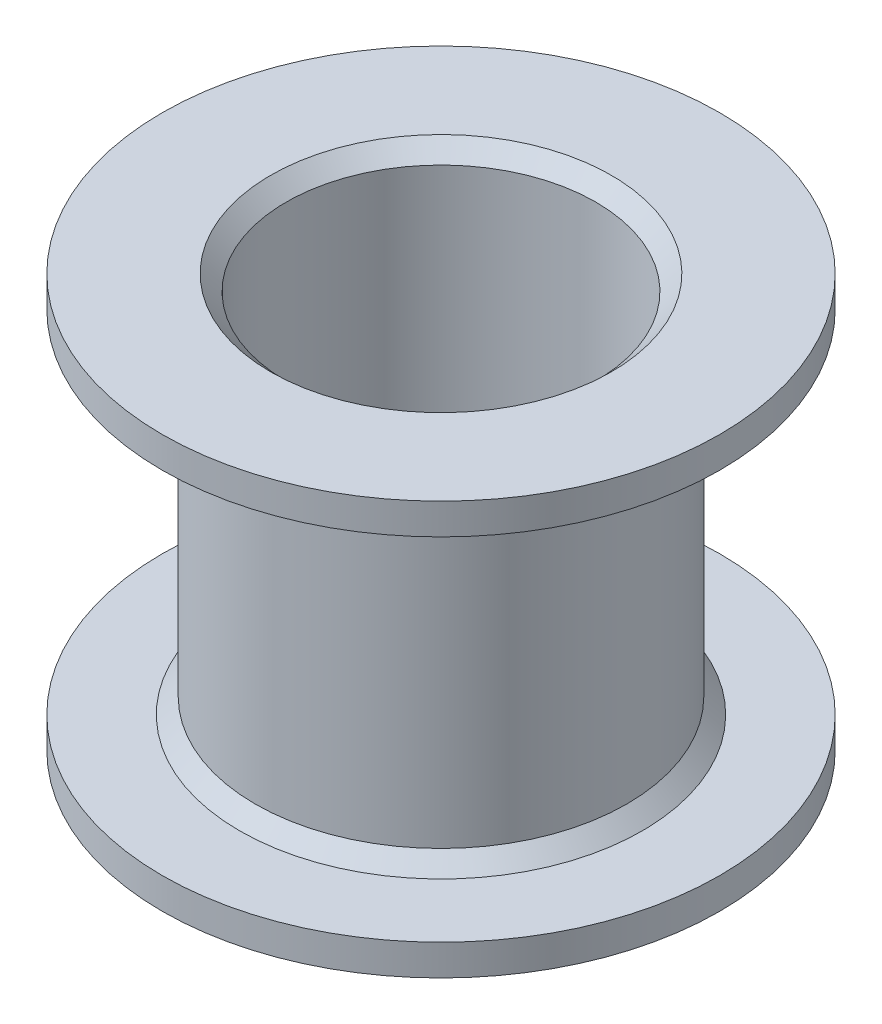
ISO-10303-21;
HEADER;
FILE_DESCRIPTION(('STEP AP214'),'2;1');
FILE_NAME('part.step','',(''),(''),'','','');
FILE_SCHEMA(('AUTOMOTIVE_DESIGN { 1 0 10303 214 1 1 1 1 }'));
ENDSEC;
DATA;
#1=APPLICATION_CONTEXT('core data for automotive mechanical design processes');
#2=APPLICATION_PROTOCOL_DEFINITION('international standard','automotive_design',2000,#1);
#3=PRODUCT_CONTEXT('',#1,'mechanical');
#4=PRODUCT('Part','Part','',(#3));
#5=PRODUCT_RELATED_PRODUCT_CATEGORY('part','',(#4));
#6=PRODUCT_DEFINITION_FORMATION('','',#4);
#7=PRODUCT_DEFINITION_CONTEXT('part definition',#1,'design');
#8=PRODUCT_DEFINITION('design','',#6,#7);
#9=PRODUCT_DEFINITION_SHAPE('','',#8);
#10=(LENGTH_UNIT() NAMED_UNIT(*) SI_UNIT(.MILLI.,.METRE.));
#11=(NAMED_UNIT(*) PLANE_ANGLE_UNIT() SI_UNIT($,.RADIAN.));
#12=(NAMED_UNIT(*) SI_UNIT($,.STERADIAN.) SOLID_ANGLE_UNIT());
#13=UNCERTAINTY_MEASURE_WITH_UNIT(LENGTH_MEASURE(1.E-05),#10,'distance_accuracy_value','');
#14=(GEOMETRIC_REPRESENTATION_CONTEXT(3) GLOBAL_UNCERTAINTY_ASSIGNED_CONTEXT((#13)) GLOBAL_UNIT_ASSIGNED_CONTEXT((#10,
#11,#12)) REPRESENTATION_CONTEXT('',''));
#15=CARTESIAN_POINT('',(0.,0.,0.));
#16=DIRECTION('',(0.,0.,1.));
#17=DIRECTION('',(1.,0.,0.));
#18=AXIS2_PLACEMENT_3D('',#15,#16,#17);
#19=CARTESIAN_POINT('',(0.,1.69999999999998,0.));
#20=DIRECTION('',(0.,-0.999999999999999,0.));
#21=DIRECTION('',(0.,0.,-0.999999999999999));
#22=AXIS2_PLACEMENT_3D('',#19,#20,#21);
#23=CYLINDRICAL_SURFACE('',#22,1.8);
#24=CARTESIAN_POINT('',(0.,1.55,0.));
#25=DIRECTION('',(0.,0.999999999999999,0.));
#26=DIRECTION('',(0.,0.,0.999999999999999));
#27=AXIS2_PLACEMENT_3D('',#24,#25,#26);
#28=CIRCLE('',#27,1.8);
#29=CARTESIAN_POINT('',(0.,1.55,-1.8));
#30=VERTEX_POINT('',#29);
#31=EDGE_CURVE('E43',#30,#30,#28,.F.);
#32=CARTESIAN_POINT('',(0.,-1.55000000000002,0.));
#33=DIRECTION('',(0.,0.999999999999999,0.));
#34=DIRECTION('',(0.,0.,0.999999999999999));
#35=AXIS2_PLACEMENT_3D('',#32,#33,#34);
#36=CIRCLE('',#35,1.8);
#37=CARTESIAN_POINT('',(0.,-1.55000000000002,-1.8));
#38=VERTEX_POINT('',#37);
#39=EDGE_CURVE('E64',#38,#38,#36,.F.);
#40=CARTESIAN_POINT('',(0.,1.55,-1.8));
#41=CARTESIAN_POINT('',(0.,1.51770833333333,-1.8));
#42=CARTESIAN_POINT('',(0.,1.48541666666667,-1.8));
#43=CARTESIAN_POINT('',(0.,1.42083333333333,-1.8));
#44=CARTESIAN_POINT('',(0.,1.38854166666667,-1.8));
#45=CARTESIAN_POINT('',(0.,1.32395833333333,-1.8));
#46=CARTESIAN_POINT('',(0.,1.29166666666666,-1.8));
#47=CARTESIAN_POINT('',(0.,1.22708333333333,-1.8));
#48=CARTESIAN_POINT('',(0.,1.19479166666666,-1.8));
#49=CARTESIAN_POINT('',(0.,1.13020833333333,-1.8));
#50=CARTESIAN_POINT('',(0.,1.09791666666666,-1.8));
#51=CARTESIAN_POINT('',(0.,1.03333333333333,-1.8));
#52=CARTESIAN_POINT('',(0.,1.00104166666666,-1.8));
#53=CARTESIAN_POINT('',(0.,0.93645833333333,-1.8));
#54=CARTESIAN_POINT('',(0.,0.904166666666663,-1.8));
#55=CARTESIAN_POINT('',(0.,0.839583333333329,-1.8));
#56=CARTESIAN_POINT('',(0.,0.807291666666662,-1.8));
#57=CARTESIAN_POINT('',(0.,0.742708333333329,-1.8));
#58=CARTESIAN_POINT('',(0.,0.710416666666662,-1.8));
#59=CARTESIAN_POINT('',(0.,0.645833333333328,-1.8));
#60=CARTESIAN_POINT('',(0.,0.613541666666661,-1.8));
#61=CARTESIAN_POINT('',(0.,0.548958333333328,-1.8));
#62=CARTESIAN_POINT('',(0.,0.516666666666661,-1.8));
#63=CARTESIAN_POINT('',(0.,0.452083333333327,-1.8));
#64=CARTESIAN_POINT('',(0.,0.41979166666666,-1.8));
#65=CARTESIAN_POINT('',(0.,0.355208333333327,-1.8));
#66=CARTESIAN_POINT('',(0.,0.32291666666666,-1.8));
#67=CARTESIAN_POINT('',(0.,0.258333333333326,-1.8));
#68=CARTESIAN_POINT('',(0.,0.226041666666659,-1.8));
#69=CARTESIAN_POINT('',(0.,0.161458333333326,-1.8));
#70=CARTESIAN_POINT('',(0.,0.129166666666659,-1.8));
#71=CARTESIAN_POINT('',(0.,0.0645833333333251,-1.8));
#72=CARTESIAN_POINT('',(0.,0.0322916666666582,-1.8));
#73=CARTESIAN_POINT('',(0.,-0.0322916666666755,-1.8));
#74=CARTESIAN_POINT('',(0.,-0.0645833333333423,-1.8));
#75=CARTESIAN_POINT('',(0.,-0.129166666666676,-1.8));
#76=CARTESIAN_POINT('',(0.,-0.161458333333343,-1.8));
#77=CARTESIAN_POINT('',(0.,-0.226041666666676,-1.8));
#78=CARTESIAN_POINT('',(0.,-0.258333333333343,-1.8));
#79=CARTESIAN_POINT('',(0.,-0.322916666666676,-1.8));
#80=CARTESIAN_POINT('',(0.,-0.355208333333343,-1.8));
#81=CARTESIAN_POINT('',(0.,-0.419791666666677,-1.8));
#82=CARTESIAN_POINT('',(0.,-0.452083333333344,-1.8));
#83=CARTESIAN_POINT('',(0.,-0.516666666666678,-1.8));
#84=CARTESIAN_POINT('',(0.,-0.548958333333345,-1.8));
#85=CARTESIAN_POINT('',(0.,-0.613541666666678,-1.8));
#86=CARTESIAN_POINT('',(0.,-0.645833333333345,-1.8));
#87=CARTESIAN_POINT('',(0.,-0.710416666666679,-1.8));
#88=CARTESIAN_POINT('',(0.,-0.742708333333346,-1.8));
#89=CARTESIAN_POINT('',(0.,-0.80729166666668,-1.8));
#90=CARTESIAN_POINT('',(0.,-0.839583333333346,-1.8));
#91=CARTESIAN_POINT('',(0.,-0.90416666666668,-1.8));
#92=CARTESIAN_POINT('',(0.,-0.936458333333347,-1.8));
#93=CARTESIAN_POINT('',(0.,-1.00104166666668,-1.8));
#94=CARTESIAN_POINT('',(0.,-1.03333333333335,-1.8));
#95=CARTESIAN_POINT('',(0.,-1.09791666666668,-1.8));
#96=CARTESIAN_POINT('',(0.,-1.13020833333335,-1.8));
#97=CARTESIAN_POINT('',(0.,-1.19479166666668,-1.8));
#98=CARTESIAN_POINT('',(0.,-1.22708333333335,-1.8));
#99=CARTESIAN_POINT('',(0.,-1.29166666666668,-1.8));
#100=CARTESIAN_POINT('',(0.,-1.32395833333335,-1.8));
#101=CARTESIAN_POINT('',(0.,-1.38854166666668,-1.8));
#102=CARTESIAN_POINT('',(0.,-1.42083333333335,-1.8));
#103=CARTESIAN_POINT('',(0.,-1.48541666666668,-1.8));
#104=CARTESIAN_POINT('',(0.,-1.51770833333335,-1.8));
#105=CARTESIAN_POINT('',(0.,-1.55000000000002,-1.8));
#106=B_SPLINE_CURVE_WITH_KNOTS('',3,(#40,#41,#42,#43,#44,#45,#46,#47,#48,#49,#50,#51,#52,#53,
#54,#55,#56,#57,#58,#59,#60,#61,#62,#63,#64,#65,#66,#67,#68,#69,#70,#71,#72,#73,#74,#75,#76,#77,
#78,#79,#80,#81,#82,#83,#84,#85,#86,#87,#88,#89,#90,#91,#92,#93,#94,#95,#96,#97,#98,#99,#100,
#101,#102,#103,#104,#105),.UNSPECIFIED.,.F.,.F.,(4,2,2,2,2,2,2,2,2,2,2,2,2,2,2,2,2,2,2,2,2,2,2,
2,2,2,2,2,2,2,2,2,4),(0.,0.0968750000000006,0.193750000000001,0.290625000000002,
0.387500000000002,0.484375000000003,0.581250000000003,0.678125000000004,0.775000000000004,
0.871875000000005,0.968750000000005,1.06562500000001,1.16250000000001,1.25937500000001,
1.35625000000001,1.45312500000001,1.55000000000001,1.64687500000001,1.74375000000001,
1.84062500000001,1.93750000000001,2.03437500000001,2.13125000000001,2.22812500000001,
2.32500000000001,2.42187500000001,2.51875000000001,2.61562500000001,2.71250000000001,
2.80937500000001,2.90625000000001,3.00312500000002,3.10000000000002),.UNSPECIFIED.);
#107=EDGE_CURVE('BSEAM32',#30,#38,#106,.T.);
#108=ORIENTED_EDGE('',*,*,#31,.T.);
#109=ORIENTED_EDGE('',*,*,#39,.F.);
#110=ORIENTED_EDGE('',*,*,#107,.T.);
#111=ORIENTED_EDGE('',*,*,#107,.F.);
#112=EDGE_LOOP('',(#108,#110,#109,#111));
#113=FACE_BOUND('',#112,.T.);
#114=ADVANCED_FACE('F32',(#113),#23,.T.);
#115=CARTESIAN_POINT('',(0.,1.69999999999998,0.));
#116=DIRECTION('',(0.,-0.999999999999999,0.));
#117=DIRECTION('',(0.,0.,-0.999999999999999));
#118=AXIS2_PLACEMENT_3D('',#115,#116,#117);
#119=CYLINDRICAL_SURFACE('',#118,1.5);
#120=CARTESIAN_POINT('',(0.,1.84999999999999,0.));
#121=DIRECTION('',(0.,0.999999999999999,0.));
#122=DIRECTION('',(0.,0.,0.999999999999999));
#123=AXIS2_PLACEMENT_3D('',#120,#121,#122);
#124=CIRCLE('',#123,1.5);
#125=CARTESIAN_POINT('',(0.,1.84999999999999,-1.5));
#126=VERTEX_POINT('',#125);
#127=EDGE_CURVE('E39',#126,#126,#124,.T.);
#128=CARTESIAN_POINT('',(0.,-1.85000000000001,0.));
#129=DIRECTION('',(0.,0.999999999999999,0.));
#130=DIRECTION('',(0.,0.,0.999999999999999));
#131=AXIS2_PLACEMENT_3D('',#128,#129,#130);
#132=CIRCLE('',#131,1.5);
#133=CARTESIAN_POINT('',(0.,-1.85000000000001,-1.5));
#134=VERTEX_POINT('',#133);
#135=EDGE_CURVE('E61',#134,#134,#132,.T.);
#136=CARTESIAN_POINT('',(0.,1.84999999999999,-1.5));
#137=CARTESIAN_POINT('',(0.,1.81145833333333,-1.5));
#138=CARTESIAN_POINT('',(0.,1.77291666666666,-1.5));
#139=CARTESIAN_POINT('',(0.,1.69583333333333,-1.5));
#140=CARTESIAN_POINT('',(0.,1.65729166666666,-1.5));
#141=CARTESIAN_POINT('',(0.,1.58020833333333,-1.5));
#142=CARTESIAN_POINT('',(0.,1.54166666666666,-1.5));
#143=CARTESIAN_POINT('',(0.,1.46458333333333,-1.5));
#144=CARTESIAN_POINT('',(0.,1.42604166666666,-1.5));
#145=CARTESIAN_POINT('',(0.,1.34895833333333,-1.5));
#146=CARTESIAN_POINT('',(0.,1.31041666666666,-1.5));
#147=CARTESIAN_POINT('',(0.,1.23333333333333,-1.5));
#148=CARTESIAN_POINT('',(0.,1.19479166666666,-1.5));
#149=CARTESIAN_POINT('',(0.,1.11770833333333,-1.5));
#150=CARTESIAN_POINT('',(0.,1.07916666666666,-1.5));
#151=CARTESIAN_POINT('',(0.,1.00208333333333,-1.5));
#152=CARTESIAN_POINT('',(0.,0.96354166666666,-1.5));
#153=CARTESIAN_POINT('',(0.,0.886458333333327,-1.5));
#154=CARTESIAN_POINT('',(0.,0.84791666666666,-1.5));
#155=CARTESIAN_POINT('',(0.,0.770833333333327,-1.5));
#156=CARTESIAN_POINT('',(0.,0.73229166666666,-1.5));
#157=CARTESIAN_POINT('',(0.,0.655208333333327,-1.5));
#158=CARTESIAN_POINT('',(0.,0.61666666666666,-1.5));
#159=CARTESIAN_POINT('',(0.,0.539583333333327,-1.5));
#160=CARTESIAN_POINT('',(0.,0.50104166666666,-1.5));
#161=CARTESIAN_POINT('',(0.,0.423958333333327,-1.5));
#162=CARTESIAN_POINT('',(0.,0.38541666666666,-1.5));
#163=CARTESIAN_POINT('',(0.,0.308333333333327,-1.5));
#164=CARTESIAN_POINT('',(0.,0.26979166666666,-1.5));
#165=CARTESIAN_POINT('',(0.,0.192708333333327,-1.5));
#166=CARTESIAN_POINT('',(0.,0.15416666666666,-1.5));
#167=CARTESIAN_POINT('',(0.,0.0770833333333267,-1.5));
#168=CARTESIAN_POINT('',(0.,0.03854166666666,-1.5));
#169=CARTESIAN_POINT('',(0.,-0.0385416666666734,-1.5));
#170=CARTESIAN_POINT('',(0.,-0.0770833333333401,-1.5));
#171=CARTESIAN_POINT('',(0.,-0.154166666666673,-1.5));
#172=CARTESIAN_POINT('',(0.,-0.19270833333334,-1.5));
#173=CARTESIAN_POINT('',(0.,-0.269791666666673,-1.5));
#174=CARTESIAN_POINT('',(0.,-0.30833333333334,-1.5));
#175=CARTESIAN_POINT('',(0.,-0.385416666666673,-1.5));
#176=CARTESIAN_POINT('',(0.,-0.42395833333334,-1.5));
#177=CARTESIAN_POINT('',(0.,-0.501041666666673,-1.5));
#178=CARTESIAN_POINT('',(0.,-0.53958333333334,-1.5));
#179=CARTESIAN_POINT('',(0.,-0.616666666666674,-1.5));
#180=CARTESIAN_POINT('',(0.,-0.65520833333334,-1.5));
#181=CARTESIAN_POINT('',(0.,-0.732291666666674,-1.5));
#182=CARTESIAN_POINT('',(0.,-0.77083333333334,-1.5));
#183=CARTESIAN_POINT('',(0.,-0.847916666666673,-1.5));
#184=CARTESIAN_POINT('',(0.,-0.88645833333334,-1.5));
#185=CARTESIAN_POINT('',(0.,-0.963541666666674,-1.5));
#186=CARTESIAN_POINT('',(0.,-1.00208333333334,-1.5));
#187=CARTESIAN_POINT('',(0.,-1.07916666666667,-1.5));
#188=CARTESIAN_POINT('',(0.,-1.11770833333334,-1.5));
#189=CARTESIAN_POINT('',(0.,-1.19479166666667,-1.5));
#190=CARTESIAN_POINT('',(0.,-1.23333333333334,-1.5));
#191=CARTESIAN_POINT('',(0.,-1.31041666666667,-1.5));
#192=CARTESIAN_POINT('',(0.,-1.34895833333334,-1.5));
#193=CARTESIAN_POINT('',(0.,-1.42604166666667,-1.5));
#194=CARTESIAN_POINT('',(0.,-1.46458333333334,-1.5));
#195=CARTESIAN_POINT('',(0.,-1.54166666666667,-1.5));
#196=CARTESIAN_POINT('',(0.,-1.58020833333334,-1.5));
#197=CARTESIAN_POINT('',(0.,-1.65729166666667,-1.5));
#198=CARTESIAN_POINT('',(0.,-1.69583333333334,-1.5));
#199=CARTESIAN_POINT('',(0.,-1.77291666666667,-1.5));
#200=CARTESIAN_POINT('',(0.,-1.81145833333334,-1.5));
#201=CARTESIAN_POINT('',(0.,-1.85000000000001,-1.5));
#202=B_SPLINE_CURVE_WITH_KNOTS('',3,(#136,#137,#138,#139,#140,#141,#142,#143,#144,#145,#146,
#147,#148,#149,#150,#151,#152,#153,#154,#155,#156,#157,#158,#159,#160,#161,#162,#163,#164,#165,
#166,#167,#168,#169,#170,#171,#172,#173,#174,#175,#176,#177,#178,#179,#180,#181,#182,#183,#184,
#185,#186,#187,#188,#189,#190,#191,#192,#193,#194,#195,#196,#197,#198,#199,#200,#201),
.UNSPECIFIED.,.F.,.F.,(4,2,2,2,2,2,2,2,2,2,2,2,2,2,2,2,2,2,2,2,2,2,2,2,2,2,2,2,2,2,2,2,4),(0.,
0.115625,0.23125,0.346875,0.4625,0.578125,0.69375,0.809375,0.925,1.040625,1.15625,1.271875,
1.3875,1.503125,1.61875,1.734375,1.85,1.965625,2.08125,2.196875,2.3125,2.428125,2.54375,
2.659375,2.775,2.890625,3.00625,3.121875,3.2375,3.353125,3.46875,3.584375,3.7),.UNSPECIFIED.);
#203=EDGE_CURVE('BSEAM95',#126,#134,#202,.T.);
#204=ORIENTED_EDGE('',*,*,#127,.T.);
#205=ORIENTED_EDGE('',*,*,#135,.F.);
#206=ORIENTED_EDGE('',*,*,#203,.T.);
#207=ORIENTED_EDGE('',*,*,#203,.F.);
#208=EDGE_LOOP('',(#204,#206,#205,#207));
#209=FACE_BOUND('',#208,.T.);
#210=ADVANCED_FACE('F95',(#209),#119,.F.);
#211=CARTESIAN_POINT('',(0.,2.,0.));
#212=DIRECTION('',(0.,0.999999999999999,0.));
#213=DIRECTION('',(0.,0.,0.999999999999999));
#214=AXIS2_PLACEMENT_3D('',#211,#212,#213);
#215=PLANE('',#214);
#216=CARTESIAN_POINT('',(0.,2.,0.));
#217=DIRECTION('',(0.,0.999999999999999,0.));
#218=DIRECTION('',(0.,0.,0.999999999999999));
#219=AXIS2_PLACEMENT_3D('',#216,#217,#218);
#220=CIRCLE('',#219,1.65);
#221=CARTESIAN_POINT('',(0.,2.,1.65));
#222=VERTEX_POINT('',#221);
#223=EDGE_CURVE('E10',#222,#222,#220,.F.);
#224=ORIENTED_EDGE('',*,*,#223,.T.);
#225=EDGE_LOOP('',(#224));
#226=FACE_BOUND('',#225,.T.);
#227=CARTESIAN_POINT('',(0.,2.,0.));
#228=DIRECTION('',(0.,0.999999999999999,0.));
#229=DIRECTION('',(0.,0.,0.999999999999999));
#230=AXIS2_PLACEMENT_3D('',#227,#228,#229);
#231=CIRCLE('',#230,2.7);
#232=CARTESIAN_POINT('',(0.,2.,-2.69999999999999));
#233=VERTEX_POINT('',#232);
#234=EDGE_CURVE('E52',#233,#233,#231,.T.);
#235=ORIENTED_EDGE('',*,*,#234,.T.);
#236=EDGE_LOOP('',(#235));
#237=FACE_BOUND('',#236,.T.);
#238=ADVANCED_FACE('F101',(#226,#237),#215,.T.);
#239=CARTESIAN_POINT('',(0.,1.69999999999998,0.));
#240=DIRECTION('',(0.,0.999999999999999,0.));
#241=DIRECTION('',(0.,0.,0.999999999999999));
#242=AXIS2_PLACEMENT_3D('',#239,#240,#241);
#243=PLANE('',#242);
#244=CARTESIAN_POINT('',(0.,1.69999999999998,0.));
#245=DIRECTION('',(0.,0.999999999999999,0.));
#246=DIRECTION('',(0.,0.,0.999999999999999));
#247=AXIS2_PLACEMENT_3D('',#244,#245,#246);
#248=CIRCLE('',#247,1.95);
#249=CARTESIAN_POINT('',(0.,1.69999999999998,1.95));
#250=VERTEX_POINT('',#249);
#251=EDGE_CURVE('E47',#250,#250,#248,.T.);
#252=ORIENTED_EDGE('',*,*,#251,.T.);
#253=EDGE_LOOP('',(#252));
#254=FACE_BOUND('',#253,.T.);
#255=CARTESIAN_POINT('',(0.,1.69999999999998,0.));
#256=DIRECTION('',(0.,0.999999999999999,0.));
#257=DIRECTION('',(0.,0.,0.999999999999999));
#258=AXIS2_PLACEMENT_3D('',#255,#256,#257);
#259=CIRCLE('',#258,2.7);
#260=CARTESIAN_POINT('',(0.,1.69999999999998,-2.69999999999999));
#261=VERTEX_POINT('',#260);
#262=EDGE_CURVE('E53',#261,#261,#259,.T.);
#263=ORIENTED_EDGE('',*,*,#262,.F.);
#264=EDGE_LOOP('',(#263));
#265=FACE_BOUND('',#264,.T.);
#266=ADVANCED_FACE('F111',(#254,#265),#243,.F.);
#267=CARTESIAN_POINT('',(0.,2.,0.));
#268=DIRECTION('',(0.,-0.999999999999999,0.));
#269=DIRECTION('',(0.,0.,-0.999999999999999));
#270=AXIS2_PLACEMENT_3D('',#267,#268,#269);
#271=CYLINDRICAL_SURFACE('',#270,2.7);
#272=CARTESIAN_POINT('',(0.,2.,-2.69999999999999));
#273=CARTESIAN_POINT('',(0.,1.996875,-2.69999999999999));
#274=CARTESIAN_POINT('',(0.,1.99375,-2.69999999999999));
#275=CARTESIAN_POINT('',(0.,1.9875,-2.69999999999999));
#276=CARTESIAN_POINT('',(0.,1.984375,-2.69999999999999));
#277=CARTESIAN_POINT('',(0.,1.978125,-2.69999999999999));
#278=CARTESIAN_POINT('',(0.,1.975,-2.69999999999999));
#279=CARTESIAN_POINT('',(0.,1.96875,-2.69999999999999));
#280=CARTESIAN_POINT('',(0.,1.965625,-2.69999999999999));
#281=CARTESIAN_POINT('',(0.,1.959375,-2.69999999999999));
#282=CARTESIAN_POINT('',(0.,1.95625,-2.69999999999999));
#283=CARTESIAN_POINT('',(0.,1.95,-2.69999999999999));
#284=CARTESIAN_POINT('',(0.,1.946875,-2.69999999999999));
#285=CARTESIAN_POINT('',(0.,1.940625,-2.69999999999999));
#286=CARTESIAN_POINT('',(0.,1.9375,-2.69999999999999));
#287=CARTESIAN_POINT('',(0.,1.93125,-2.69999999999999));
#288=CARTESIAN_POINT('',(0.,1.928125,-2.69999999999999));
#289=CARTESIAN_POINT('',(0.,1.921875,-2.69999999999999));
#290=CARTESIAN_POINT('',(0.,1.91875,-2.69999999999999));
#291=CARTESIAN_POINT('',(0.,1.9125,-2.69999999999999));
#292=CARTESIAN_POINT('',(0.,1.909375,-2.69999999999999));
#293=CARTESIAN_POINT('',(0.,1.903125,-2.69999999999999));
#294=CARTESIAN_POINT('',(0.,1.9,-2.69999999999999));
#295=CARTESIAN_POINT('',(0.,1.89375,-2.69999999999999));
#296=CARTESIAN_POINT('',(0.,1.89062499999999,-2.69999999999999));
#297=CARTESIAN_POINT('',(0.,1.88437499999999,-2.69999999999999));
#298=CARTESIAN_POINT('',(0.,1.88124999999999,-2.69999999999999));
#299=CARTESIAN_POINT('',(0.,1.87499999999999,-2.69999999999999));
#300=CARTESIAN_POINT('',(0.,1.87187499999999,-2.69999999999999));
#301=CARTESIAN_POINT('',(0.,1.86562499999999,-2.69999999999999));
#302=CARTESIAN_POINT('',(0.,1.86249999999999,-2.69999999999999));
#303=CARTESIAN_POINT('',(0.,1.85624999999999,-2.69999999999999));
#304=CARTESIAN_POINT('',(0.,1.85312499999999,-2.69999999999999));
#305=CARTESIAN_POINT('',(0.,1.84687499999999,-2.69999999999999));
#306=CARTESIAN_POINT('',(0.,1.84374999999999,-2.69999999999999));
#307=CARTESIAN_POINT('',(0.,1.83749999999999,-2.69999999999999));
#308=CARTESIAN_POINT('',(0.,1.83437499999999,-2.69999999999999));
#309=CARTESIAN_POINT('',(0.,1.82812499999999,-2.69999999999999));
#310=CARTESIAN_POINT('',(0.,1.82499999999999,-2.69999999999999));
#311=CARTESIAN_POINT('',(0.,1.81874999999999,-2.69999999999999));
#312=CARTESIAN_POINT('',(0.,1.81562499999999,-2.69999999999999));
#313=CARTESIAN_POINT('',(0.,1.80937499999999,-2.69999999999999));
#314=CARTESIAN_POINT('',(0.,1.80624999999999,-2.69999999999999));
#315=CARTESIAN_POINT('',(0.,1.79999999999999,-2.69999999999999));
#316=CARTESIAN_POINT('',(0.,1.79687499999999,-2.69999999999999));
#317=CARTESIAN_POINT('',(0.,1.79062499999999,-2.69999999999999));
#318=CARTESIAN_POINT('',(0.,1.78749999999999,-2.69999999999999));
#319=CARTESIAN_POINT('',(0.,1.78124999999999,-2.69999999999999));
#320=CARTESIAN_POINT('',(0.,1.77812499999999,-2.69999999999999));
#321=CARTESIAN_POINT('',(0.,1.77187499999999,-2.69999999999999));
#322=CARTESIAN_POINT('',(0.,1.76874999999999,-2.69999999999999));
#323=CARTESIAN_POINT('',(0.,1.76249999999999,-2.69999999999999));
#324=CARTESIAN_POINT('',(0.,1.75937499999999,-2.69999999999999));
#325=CARTESIAN_POINT('',(0.,1.75312499999999,-2.69999999999999));
#326=CARTESIAN_POINT('',(0.,1.74999999999999,-2.69999999999999));
#327=CARTESIAN_POINT('',(0.,1.74374999999999,-2.69999999999999));
#328=CARTESIAN_POINT('',(0.,1.74062499999999,-2.69999999999999));
#329=CARTESIAN_POINT('',(0.,1.73437499999999,-2.69999999999999));
#330=CARTESIAN_POINT('',(0.,1.73124999999999,-2.69999999999999));
#331=CARTESIAN_POINT('',(0.,1.72499999999998,-2.69999999999999));
#332=CARTESIAN_POINT('',(0.,1.72187499999998,-2.69999999999999));
#333=CARTESIAN_POINT('',(0.,1.71562499999998,-2.69999999999999));
#334=CARTESIAN_POINT('',(0.,1.71249999999998,-2.69999999999999));
#335=CARTESIAN_POINT('',(0.,1.70624999999998,-2.69999999999999));
#336=CARTESIAN_POINT('',(0.,1.70312499999998,-2.69999999999999));
#337=CARTESIAN_POINT('',(0.,1.69999999999998,-2.69999999999999));
#338=B_SPLINE_CURVE_WITH_KNOTS('',3,(#272,#273,#274,#275,#276,#277,#278,#279,#280,#281,#282,
#283,#284,#285,#286,#287,#288,#289,#290,#291,#292,#293,#294,#295,#296,#297,#298,#299,#300,#301,
#302,#303,#304,#305,#306,#307,#308,#309,#310,#311,#312,#313,#314,#315,#316,#317,#318,#319,#320,
#321,#322,#323,#324,#325,#326,#327,#328,#329,#330,#331,#332,#333,#334,#335,#336,#337),
.UNSPECIFIED.,.F.,.F.,(4,2,2,2,2,2,2,2,2,2,2,2,2,2,2,2,2,2,2,2,2,2,2,2,2,2,2,2,2,2,2,2,4),(0.,
0.00937500000000027,0.018750000000001,0.0281250000000017,0.0375000000000024,0.0468750000000029,
0.0562500000000033,0.065625000000004,0.0750000000000045,0.0843750000000052,0.0937500000000057,
0.103125000000006,0.112500000000007,0.121875000000008,0.131250000000008,0.140625000000009,
0.150000000000009,0.15937500000001,0.16875000000001,0.178125000000011,0.187500000000012,
0.196875000000012,0.206250000000013,0.215625000000014,0.225000000000014,0.234375000000015,
0.243750000000015,0.253125000000016,0.262500000000016,0.271875000000017,0.281250000000018,
0.290625000000018,0.300000000000019),.UNSPECIFIED.);
#339=EDGE_CURVE('BSEAM106',#233,#261,#338,.T.);
#340=ORIENTED_EDGE('',*,*,#234,.F.);
#341=ORIENTED_EDGE('',*,*,#262,.T.);
#342=ORIENTED_EDGE('',*,*,#339,.T.);
#343=ORIENTED_EDGE('',*,*,#339,.F.);
#344=EDGE_LOOP('',(#340,#342,#341,#343));
#345=FACE_BOUND('',#344,.T.);
#346=ADVANCED_FACE('F106',(#345),#271,.T.);
#347=CARTESIAN_POINT('',(0.,1.69999999999998,0.));
#348=DIRECTION('',(0.,0.999999999999999,0.));
#349=DIRECTION('',(0.,0.,0.999999999999999));
#350=AXIS2_PLACEMENT_3D('',#347,#348,#349);
#351=CONICAL_SURFACE('',#350,1.95,0.785398163397452);
#352=ORIENTED_EDGE('',*,*,#31,.F.);
#353=EDGE_LOOP('',(#352));
#354=FACE_BOUND('',#353,.T.);
#355=ORIENTED_EDGE('',*,*,#251,.F.);
#356=EDGE_LOOP('',(#355));
#357=FACE_BOUND('',#356,.T.);
#358=ADVANCED_FACE('F91',(#354,#357),#351,.T.);
#359=CARTESIAN_POINT('',(0.,1.84999999999999,0.));
#360=DIRECTION('',(0.,0.999999999999999,0.));
#361=DIRECTION('',(0.,0.,0.999999999999999));
#362=AXIS2_PLACEMENT_3D('',#359,#360,#361);
#363=CONICAL_SURFACE('',#362,1.5,0.785398163397451);
#364=ORIENTED_EDGE('',*,*,#223,.F.);
#365=EDGE_LOOP('',(#364));
#366=FACE_BOUND('',#365,.T.);
#367=ORIENTED_EDGE('',*,*,#127,.F.);
#368=EDGE_LOOP('',(#367));
#369=FACE_BOUND('',#368,.T.);
#370=ADVANCED_FACE('F34',(#366,#369),#363,.F.);
#371=CARTESIAN_POINT('',(0.,-2.00000000000002,0.));
#372=DIRECTION('',(0.,-0.999999999999999,0.));
#373=DIRECTION('',(0.,0.,0.999999999999999));
#374=AXIS2_PLACEMENT_3D('',#371,#372,#373);
#375=PLANE('',#374);
#376=CARTESIAN_POINT('',(0.,-2.00000000000002,0.));
#377=DIRECTION('',(0.,0.999999999999999,0.));
#378=DIRECTION('',(0.,0.,0.999999999999999));
#379=AXIS2_PLACEMENT_3D('',#376,#377,#378);
#380=CIRCLE('',#379,1.65);
#381=CARTESIAN_POINT('',(0.,-2.00000000000002,1.65));
#382=VERTEX_POINT('',#381);
#383=EDGE_CURVE('E56',#382,#382,#380,.F.);
#384=ORIENTED_EDGE('',*,*,#383,.F.);
#385=EDGE_LOOP('',(#384));
#386=FACE_BOUND('',#385,.T.);
#387=CARTESIAN_POINT('',(0.,-2.00000000000002,0.));
#388=DIRECTION('',(0.,0.999999999999999,0.));
#389=DIRECTION('',(0.,0.,0.999999999999999));
#390=AXIS2_PLACEMENT_3D('',#387,#388,#389);
#391=CIRCLE('',#390,2.7);
#392=CARTESIAN_POINT('',(0.,-2.00000000000002,-2.69999999999999));
#393=VERTEX_POINT('',#392);
#394=EDGE_CURVE('E70',#393,#393,#391,.T.);
#395=ORIENTED_EDGE('',*,*,#394,.F.);
#396=EDGE_LOOP('',(#395));
#397=FACE_BOUND('',#396,.T.);
#398=ADVANCED_FACE('F80',(#386,#397),#375,.T.);
#399=CARTESIAN_POINT('',(0.,-1.7,0.));
#400=DIRECTION('',(0.,-0.999999999999999,0.));
#401=DIRECTION('',(0.,0.,0.999999999999999));
#402=AXIS2_PLACEMENT_3D('',#399,#400,#401);
#403=PLANE('',#402);
#404=CARTESIAN_POINT('',(0.,-1.7,0.));
#405=DIRECTION('',(0.,0.999999999999999,0.));
#406=DIRECTION('',(0.,0.,0.999999999999999));
#407=AXIS2_PLACEMENT_3D('',#404,#405,#406);
#408=CIRCLE('',#407,1.95);
#409=CARTESIAN_POINT('',(0.,-1.7,1.95));
#410=VERTEX_POINT('',#409);
#411=EDGE_CURVE('E67',#410,#410,#408,.T.);
#412=ORIENTED_EDGE('',*,*,#411,.F.);
#413=EDGE_LOOP('',(#412));
#414=FACE_BOUND('',#413,.T.);
#415=CARTESIAN_POINT('',(0.,-1.7,0.));
#416=DIRECTION('',(0.,0.999999999999999,0.));
#417=DIRECTION('',(0.,0.,0.999999999999999));
#418=AXIS2_PLACEMENT_3D('',#415,#416,#417);
#419=CIRCLE('',#418,2.7);
#420=CARTESIAN_POINT('',(0.,-1.7,-2.69999999999999));
#421=VERTEX_POINT('',#420);
#422=EDGE_CURVE('E71',#421,#421,#419,.T.);
#423=ORIENTED_EDGE('',*,*,#422,.T.);
#424=EDGE_LOOP('',(#423));
#425=FACE_BOUND('',#424,.T.);
#426=ADVANCED_FACE('F82',(#414,#425),#403,.F.);
#427=CARTESIAN_POINT('',(0.,-2.00000000000002,0.));
#428=DIRECTION('',(0.,0.999999999999999,0.));
#429=DIRECTION('',(0.,0.,-0.999999999999999));
#430=AXIS2_PLACEMENT_3D('',#427,#428,#429);
#431=CYLINDRICAL_SURFACE('',#430,2.7);
#432=CARTESIAN_POINT('',(0.,-2.00000000000002,-2.69999999999999));
#433=CARTESIAN_POINT('',(0.,-1.99687500000002,-2.69999999999999));
#434=CARTESIAN_POINT('',(0.,-1.99375000000002,-2.69999999999999));
#435=CARTESIAN_POINT('',(0.,-1.98750000000002,-2.69999999999999));
#436=CARTESIAN_POINT('',(0.,-1.98437500000002,-2.69999999999999));
#437=CARTESIAN_POINT('',(0.,-1.97812500000002,-2.69999999999999));
#438=CARTESIAN_POINT('',(0.,-1.97500000000002,-2.69999999999999));
#439=CARTESIAN_POINT('',(0.,-1.96875000000002,-2.69999999999999));
#440=CARTESIAN_POINT('',(0.,-1.96562500000002,-2.69999999999999));
#441=CARTESIAN_POINT('',(0.,-1.95937500000002,-2.69999999999999));
#442=CARTESIAN_POINT('',(0.,-1.95625000000002,-2.69999999999999));
#443=CARTESIAN_POINT('',(0.,-1.95000000000002,-2.69999999999999));
#444=CARTESIAN_POINT('',(0.,-1.94687500000002,-2.69999999999999));
#445=CARTESIAN_POINT('',(0.,-1.94062500000002,-2.69999999999999));
#446=CARTESIAN_POINT('',(0.,-1.93750000000001,-2.69999999999999));
#447=CARTESIAN_POINT('',(0.,-1.93125000000001,-2.69999999999999));
#448=CARTESIAN_POINT('',(0.,-1.92812500000001,-2.69999999999999));
#449=CARTESIAN_POINT('',(0.,-1.92187500000001,-2.69999999999999));
#450=CARTESIAN_POINT('',(0.,-1.91875000000001,-2.69999999999999));
#451=CARTESIAN_POINT('',(0.,-1.91250000000001,-2.69999999999999));
#452=CARTESIAN_POINT('',(0.,-1.90937500000001,-2.69999999999999));
#453=CARTESIAN_POINT('',(0.,-1.90312500000001,-2.69999999999999));
#454=CARTESIAN_POINT('',(0.,-1.90000000000001,-2.69999999999999));
#455=CARTESIAN_POINT('',(0.,-1.89375000000001,-2.69999999999999));
#456=CARTESIAN_POINT('',(0.,-1.89062500000001,-2.69999999999999));
#457=CARTESIAN_POINT('',(0.,-1.88437500000001,-2.69999999999999));
#458=CARTESIAN_POINT('',(0.,-1.88125000000001,-2.69999999999999));
#459=CARTESIAN_POINT('',(0.,-1.87500000000001,-2.69999999999999));
#460=CARTESIAN_POINT('',(0.,-1.87187500000001,-2.69999999999999));
#461=CARTESIAN_POINT('',(0.,-1.86562500000001,-2.69999999999999));
#462=CARTESIAN_POINT('',(0.,-1.86250000000001,-2.69999999999999));
#463=CARTESIAN_POINT('',(0.,-1.85625000000001,-2.69999999999999));
#464=CARTESIAN_POINT('',(0.,-1.85312500000001,-2.69999999999999));
#465=CARTESIAN_POINT('',(0.,-1.84687500000001,-2.69999999999999));
#466=CARTESIAN_POINT('',(0.,-1.84375000000001,-2.69999999999999));
#467=CARTESIAN_POINT('',(0.,-1.83750000000001,-2.69999999999999));
#468=CARTESIAN_POINT('',(0.,-1.83437500000001,-2.69999999999999));
#469=CARTESIAN_POINT('',(0.,-1.82812500000001,-2.69999999999999));
#470=CARTESIAN_POINT('',(0.,-1.82500000000001,-2.69999999999999));
#471=CARTESIAN_POINT('',(0.,-1.81875000000001,-2.69999999999999));
#472=CARTESIAN_POINT('',(0.,-1.81562500000001,-2.69999999999999));
#473=CARTESIAN_POINT('',(0.,-1.80937500000001,-2.69999999999999));
#474=CARTESIAN_POINT('',(0.,-1.80625000000001,-2.69999999999999));
#475=CARTESIAN_POINT('',(0.,-1.80000000000001,-2.69999999999999));
#476=CARTESIAN_POINT('',(0.,-1.79687500000001,-2.69999999999999));
#477=CARTESIAN_POINT('',(0.,-1.79062500000001,-2.69999999999999));
#478=CARTESIAN_POINT('',(0.,-1.78750000000001,-2.69999999999999));
#479=CARTESIAN_POINT('',(0.,-1.78125000000001,-2.69999999999999));
#480=CARTESIAN_POINT('',(0.,-1.77812500000001,-2.69999999999999));
#481=CARTESIAN_POINT('',(0.,-1.771875,-2.69999999999999));
#482=CARTESIAN_POINT('',(0.,-1.76875,-2.69999999999999));
#483=CARTESIAN_POINT('',(0.,-1.7625,-2.69999999999999));
#484=CARTESIAN_POINT('',(0.,-1.759375,-2.69999999999999));
#485=CARTESIAN_POINT('',(0.,-1.753125,-2.69999999999999));
#486=CARTESIAN_POINT('',(0.,-1.75,-2.69999999999999));
#487=CARTESIAN_POINT('',(0.,-1.74375,-2.69999999999999));
#488=CARTESIAN_POINT('',(0.,-1.740625,-2.69999999999999));
#489=CARTESIAN_POINT('',(0.,-1.734375,-2.69999999999999));
#490=CARTESIAN_POINT('',(0.,-1.73125,-2.69999999999999));
#491=CARTESIAN_POINT('',(0.,-1.725,-2.69999999999999));
#492=CARTESIAN_POINT('',(0.,-1.721875,-2.69999999999999));
#493=CARTESIAN_POINT('',(0.,-1.715625,-2.69999999999999));
#494=CARTESIAN_POINT('',(0.,-1.7125,-2.69999999999999));
#495=CARTESIAN_POINT('',(0.,-1.70625,-2.69999999999999));
#496=CARTESIAN_POINT('',(0.,-1.703125,-2.69999999999999));
#497=CARTESIAN_POINT('',(0.,-1.7,-2.69999999999999));
#498=B_SPLINE_CURVE_WITH_KNOTS('',3,(#432,#433,#434,#435,#436,#437,#438,#439,#440,#441,#442,
#443,#444,#445,#446,#447,#448,#449,#450,#451,#452,#453,#454,#455,#456,#457,#458,#459,#460,#461,
#462,#463,#464,#465,#466,#467,#468,#469,#470,#471,#472,#473,#474,#475,#476,#477,#478,#479,#480,
#481,#482,#483,#484,#485,#486,#487,#488,#489,#490,#491,#492,#493,#494,#495,#496,#497),
.UNSPECIFIED.,.F.,.F.,(4,2,2,2,2,2,2,2,2,2,2,2,2,2,2,2,2,2,2,2,2,2,2,2,2,2,2,2,2,2,2,2,4),(0.,
0.00937500000000027,0.018750000000001,0.0281250000000017,0.0375000000000019,0.0468750000000026,
0.0562500000000033,0.0656250000000038,0.0750000000000045,0.084375000000005,0.0937500000000057,
0.103125000000006,0.112500000000007,0.121875000000007,0.131250000000008,0.140625000000009,
0.150000000000009,0.15937500000001,0.16875000000001,0.178125000000011,0.187500000000012,
0.196875000000012,0.206250000000013,0.215625000000013,0.225000000000014,0.234375000000015,
0.243750000000015,0.253125000000016,0.262500000000016,0.271875000000017,0.281250000000018,
0.290625000000018,0.300000000000019),.UNSPECIFIED.);
#499=EDGE_CURVE('BSEAM77',#393,#421,#498,.T.);
#500=ORIENTED_EDGE('',*,*,#394,.T.);
#501=ORIENTED_EDGE('',*,*,#422,.F.);
#502=ORIENTED_EDGE('',*,*,#499,.T.);
#503=ORIENTED_EDGE('',*,*,#499,.F.);
#504=EDGE_LOOP('',(#500,#502,#501,#503));
#505=FACE_BOUND('',#504,.T.);
#506=ADVANCED_FACE('F77',(#505),#431,.T.);
#507=CARTESIAN_POINT('',(0.,-1.7,0.));
#508=DIRECTION('',(0.,-0.999999999999999,0.));
#509=DIRECTION('',(0.,0.,0.999999999999999));
#510=AXIS2_PLACEMENT_3D('',#507,#508,#509);
#511=CONICAL_SURFACE('',#510,1.95,0.785398163397452);
#512=ORIENTED_EDGE('',*,*,#39,.T.);
#513=EDGE_LOOP('',(#512));
#514=FACE_BOUND('',#513,.T.);
#515=ORIENTED_EDGE('',*,*,#411,.T.);
#516=EDGE_LOOP('',(#515));
#517=FACE_BOUND('',#516,.T.);
#518=ADVANCED_FACE('F130',(#514,#517),#511,.T.);
#519=CARTESIAN_POINT('',(0.,-1.85000000000001,0.));
#520=DIRECTION('',(0.,-0.999999999999999,0.));
#521=DIRECTION('',(0.,0.,0.999999999999999));
#522=AXIS2_PLACEMENT_3D('',#519,#520,#521);
#523=CONICAL_SURFACE('',#522,1.5,0.785398163397451);
#524=ORIENTED_EDGE('',*,*,#383,.T.);
#525=EDGE_LOOP('',(#524));
#526=FACE_BOUND('',#525,.T.);
#527=ORIENTED_EDGE('',*,*,#135,.T.);
#528=EDGE_LOOP('',(#527));
#529=FACE_BOUND('',#528,.T.);
#530=ADVANCED_FACE('F127',(#526,#529),#523,.F.);
#531=CLOSED_SHELL('',(#114,#210,#238,#266,#346,#358,#370,#398,#426,#506,#518,#530));
#532=MANIFOLD_SOLID_BREP('B2',#531);
#533=ADVANCED_BREP_SHAPE_REPRESENTATION('',(#18,#532),#14);
#534=SHAPE_DEFINITION_REPRESENTATION(#9,#533);
ENDSEC;
END-ISO-10303-21;
